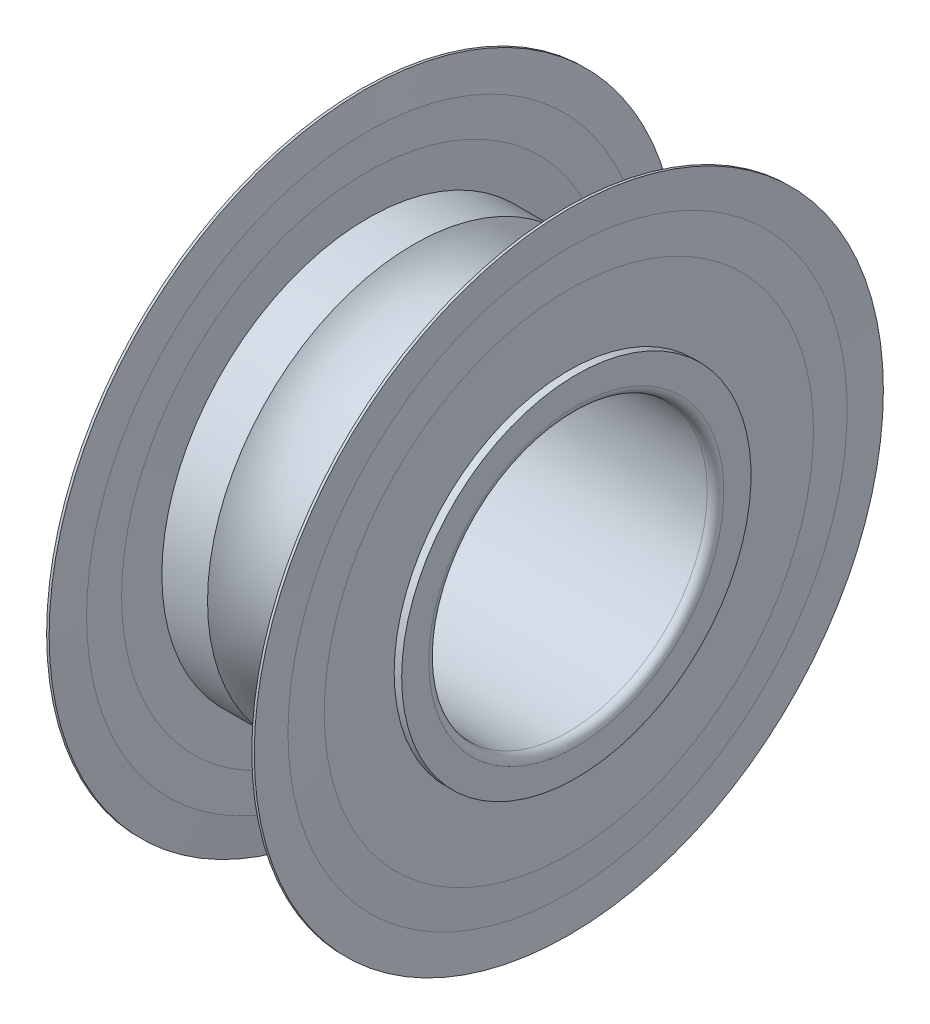
ISO-10303-21;
HEADER;
FILE_DESCRIPTION(('STEP AP214'),'2;1');
FILE_NAME('part.step','',(''),(''),'','','');
FILE_SCHEMA(('AUTOMOTIVE_DESIGN { 1 0 10303 214 1 1 1 1 }'));
ENDSEC;
DATA;
#1=APPLICATION_CONTEXT('core data for automotive mechanical design processes');
#2=APPLICATION_PROTOCOL_DEFINITION('international standard','automotive_design',2000,#1);
#3=PRODUCT_CONTEXT('',#1,'mechanical');
#4=PRODUCT('Part','Part','',(#3));
#5=PRODUCT_RELATED_PRODUCT_CATEGORY('part','',(#4));
#6=PRODUCT_DEFINITION_FORMATION('','',#4);
#7=PRODUCT_DEFINITION_CONTEXT('part definition',#1,'design');
#8=PRODUCT_DEFINITION('design','',#6,#7);
#9=PRODUCT_DEFINITION_SHAPE('','',#8);
#10=(LENGTH_UNIT() NAMED_UNIT(*) SI_UNIT(.MILLI.,.METRE.));
#11=(NAMED_UNIT(*) PLANE_ANGLE_UNIT() SI_UNIT($,.RADIAN.));
#12=(NAMED_UNIT(*) SI_UNIT($,.STERADIAN.) SOLID_ANGLE_UNIT());
#13=UNCERTAINTY_MEASURE_WITH_UNIT(LENGTH_MEASURE(1.E-05),#10,'distance_accuracy_value','');
#14=(GEOMETRIC_REPRESENTATION_CONTEXT(3) GLOBAL_UNCERTAINTY_ASSIGNED_CONTEXT((#13)) GLOBAL_UNIT_ASSIGNED_CONTEXT((#10,
#11,#12)) REPRESENTATION_CONTEXT('',''));
#15=CARTESIAN_POINT('',(0.,0.,0.));
#16=DIRECTION('',(0.,0.,1.));
#17=DIRECTION('',(1.,0.,0.));
#18=AXIS2_PLACEMENT_3D('',#15,#16,#17);
#19=CARTESIAN_POINT('',(7.71499999999991,0.,0.));
#20=DIRECTION('',(-1.,0.,0.));
#21=DIRECTION('',(0.,0.,1.));
#22=AXIS2_PLACEMENT_3D('',#19,#20,#21);
#23=TOROIDAL_SURFACE('',#22,6.49999999999991,0.224999999999907);
#24=CARTESIAN_POINT('',(7.49,0.,0.));
#25=DIRECTION('',(-1.,0.,0.));
#26=DIRECTION('',(0.,0.,1.));
#27=AXIS2_PLACEMENT_3D('',#24,#25,#26);
#28=CIRCLE('',#27,6.5);
#29=CARTESIAN_POINT('',(7.49,0.,6.5));
#30=VERTEX_POINT('',#29);
#31=EDGE_CURVE('E61',#30,#30,#28,.T.);
#32=ORIENTED_EDGE('',*,*,#31,.F.);
#33=EDGE_LOOP('',(#32));
#34=FACE_BOUND('',#33,.T.);
#35=CARTESIAN_POINT('',(7.63953312443505,0.,0.));
#36=DIRECTION('',(-1.,0.,0.));
#37=DIRECTION('',(0.,0.,1.));
#38=AXIS2_PLACEMENT_3D('',#35,#36,#37);
#39=CIRCLE('',#38,6.28803360952153);
#40=CARTESIAN_POINT('',(7.63953312443505,0.,6.28803360952153));
#41=VERTEX_POINT('',#40);
#42=EDGE_CURVE('E34',#41,#41,#39,.T.);
#43=ORIENTED_EDGE('',*,*,#42,.T.);
#44=EDGE_LOOP('',(#43));
#45=FACE_BOUND('',#44,.T.);
#46=ADVANCED_FACE('F30',(#34,#45),#23,.F.);
#47=CARTESIAN_POINT('',(50.,0.,0.));
#48=DIRECTION('',(-1.,0.,0.));
#49=DIRECTION('',(0.,0.,1.));
#50=AXIS2_PLACEMENT_3D('',#47,#48,#49);
#51=CYLINDRICAL_SURFACE('',#50,6.275);
#52=CARTESIAN_POINT('',(8.,0.,0.));
#53=DIRECTION('',(-1.,0.,0.));
#54=DIRECTION('',(0.,0.,1.));
#55=AXIS2_PLACEMENT_3D('',#52,#53,#54);
#56=CIRCLE('',#55,6.275);
#57=CARTESIAN_POINT('',(8.,0.,6.275));
#58=VERTEX_POINT('',#57);
#59=EDGE_CURVE('E56',#58,#58,#56,.T.);
#60=ORIENTED_EDGE('',*,*,#59,.T.);
#61=EDGE_LOOP('',(#60));
#62=FACE_BOUND('',#61,.T.);
#63=CARTESIAN_POINT('',(7.73,0.,0.));
#64=DIRECTION('',(-1.,0.,0.));
#65=DIRECTION('',(0.,0.,1.));
#66=AXIS2_PLACEMENT_3D('',#63,#64,#65);
#67=CIRCLE('',#66,6.275);
#68=CARTESIAN_POINT('',(7.73,0.,6.275));
#69=VERTEX_POINT('',#68);
#70=EDGE_CURVE('E158',#69,#69,#67,.T.);
#71=ORIENTED_EDGE('',*,*,#70,.F.);
#72=EDGE_LOOP('',(#71));
#73=FACE_BOUND('',#72,.T.);
#74=ADVANCED_FACE('F107',(#62,#73),#51,.T.);
#75=CARTESIAN_POINT('',(50.,0.,0.));
#76=DIRECTION('',(-1.,0.,0.));
#77=DIRECTION('',(0.,0.,1.));
#78=AXIS2_PLACEMENT_3D('',#75,#76,#77);
#79=CYLINDRICAL_SURFACE('',#78,6.275);
#80=CARTESIAN_POINT('',(0.,0.,0.));
#81=DIRECTION('',(-1.,0.,0.));
#82=DIRECTION('',(0.,0.,1.));
#83=AXIS2_PLACEMENT_3D('',#80,#81,#82);
#84=CIRCLE('',#83,6.275);
#85=CARTESIAN_POINT('',(0.,0.,6.275));
#86=VERTEX_POINT('',#85);
#87=EDGE_CURVE('E51',#86,#86,#84,.T.);
#88=ORIENTED_EDGE('',*,*,#87,.F.);
#89=EDGE_LOOP('',(#88));
#90=FACE_BOUND('',#89,.T.);
#91=CARTESIAN_POINT('',(0.269999999999999,0.,0.));
#92=DIRECTION('',(-1.,0.,0.));
#93=DIRECTION('',(0.,0.,1.));
#94=AXIS2_PLACEMENT_3D('',#91,#92,#93);
#95=CIRCLE('',#94,6.275);
#96=CARTESIAN_POINT('',(0.269999999999999,0.,6.275));
#97=VERTEX_POINT('',#96);
#98=EDGE_CURVE('E182',#97,#97,#95,.T.);
#99=ORIENTED_EDGE('',*,*,#98,.T.);
#100=EDGE_LOOP('',(#99));
#101=FACE_BOUND('',#100,.T.);
#102=ADVANCED_FACE('F113',(#90,#101),#79,.T.);
#103=CARTESIAN_POINT('',(0.285000000000041,0.,0.));
#104=DIRECTION('',(-1.,0.,0.));
#105=DIRECTION('',(0.,0.,1.));
#106=AXIS2_PLACEMENT_3D('',#103,#104,#105);
#107=TOROIDAL_SURFACE('',#106,6.49999999999996,0.224999999999959);
#108=CARTESIAN_POINT('',(0.509999999999997,0.,0.));
#109=DIRECTION('',(-1.,0.,0.));
#110=DIRECTION('',(0.,0.,1.));
#111=AXIS2_PLACEMENT_3D('',#108,#109,#110);
#112=CIRCLE('',#111,6.49999999999996);
#113=CARTESIAN_POINT('',(0.509999999999997,0.,6.49999999999996));
#114=VERTEX_POINT('',#113);
#115=EDGE_CURVE('E75',#114,#114,#112,.T.);
#116=ORIENTED_EDGE('',*,*,#115,.T.);
#117=EDGE_LOOP('',(#116));
#118=FACE_BOUND('',#117,.T.);
#119=CARTESIAN_POINT('',(0.360466875564949,0.,0.));
#120=DIRECTION('',(1.,0.,0.));
#121=DIRECTION('',(0.,0.,-1.));
#122=AXIS2_PLACEMENT_3D('',#119,#120,#121);
#123=CIRCLE('',#122,6.28803360952153);
#124=CARTESIAN_POINT('',(0.360466875564949,0.,-6.28803360952153));
#125=VERTEX_POINT('',#124);
#126=EDGE_CURVE('E54',#125,#125,#123,.T.);
#127=ORIENTED_EDGE('',*,*,#126,.T.);
#128=EDGE_LOOP('',(#127));
#129=FACE_BOUND('',#128,.T.);
#130=ADVANCED_FACE('F129',(#118,#129),#107,.F.);
#131=CARTESIAN_POINT('',(0.,7.3,0.));
#132=DIRECTION('',(1.,0.,0.));
#133=DIRECTION('',(0.,0.,-1.));
#134=AXIS2_PLACEMENT_3D('',#131,#132,#133);
#135=PLANE('',#134);
#136=CARTESIAN_POINT('',(0.,0.,0.));
#137=DIRECTION('',(-1.,0.,0.));
#138=DIRECTION('',(0.,0.,1.));
#139=AXIS2_PLACEMENT_3D('',#136,#137,#138);
#140=CIRCLE('',#139,5.3);
#141=CARTESIAN_POINT('',(0.,0.,5.3));
#142=VERTEX_POINT('',#141);
#143=EDGE_CURVE('E10',#142,#142,#140,.T.);
#144=ORIENTED_EDGE('',*,*,#143,.F.);
#145=EDGE_LOOP('',(#144));
#146=FACE_BOUND('',#145,.T.);
#147=ORIENTED_EDGE('',*,*,#87,.T.);
#148=EDGE_LOOP('',(#147));
#149=FACE_BOUND('',#148,.T.);
#150=ADVANCED_FACE('F32',(#146,#149),#135,.F.);
#151=CARTESIAN_POINT('',(8.,5.3,0.));
#152=DIRECTION('',(-1.,0.,0.));
#153=DIRECTION('',(0.,0.,1.));
#154=AXIS2_PLACEMENT_3D('',#151,#152,#153);
#155=PLANE('',#154);
#156=CARTESIAN_POINT('',(8.,0.,0.));
#157=DIRECTION('',(-1.,0.,0.));
#158=DIRECTION('',(0.,0.,1.));
#159=AXIS2_PLACEMENT_3D('',#156,#157,#158);
#160=CIRCLE('',#159,5.29999999999988);
#161=CARTESIAN_POINT('',(8.,0.,5.29999999999988));
#162=VERTEX_POINT('',#161);
#163=EDGE_CURVE('E85',#162,#162,#160,.T.);
#164=ORIENTED_EDGE('',*,*,#163,.T.);
#165=EDGE_LOOP('',(#164));
#166=FACE_BOUND('',#165,.T.);
#167=ORIENTED_EDGE('',*,*,#59,.F.);
#168=EDGE_LOOP('',(#167));
#169=FACE_BOUND('',#168,.T.);
#170=ADVANCED_FACE('F100',(#166,#169),#155,.F.);
#171=CARTESIAN_POINT('',(0.29999999999994,0.,0.));
#172=DIRECTION('',(-1.,0.,0.));
#173=DIRECTION('',(0.,0.,1.));
#174=AXIS2_PLACEMENT_3D('',#171,#172,#173);
#175=TOROIDAL_SURFACE('',#174,5.29999999999994,0.29999999999994);
#176=CARTESIAN_POINT('',(0.300000000000002,0.,0.));
#177=DIRECTION('',(-1.,0.,0.));
#178=DIRECTION('',(0.,0.,1.));
#179=AXIS2_PLACEMENT_3D('',#176,#177,#178);
#180=CIRCLE('',#179,5.);
#181=CARTESIAN_POINT('',(0.300000000000002,0.,5.));
#182=VERTEX_POINT('',#181);
#183=EDGE_CURVE('E38',#182,#182,#180,.T.);
#184=ORIENTED_EDGE('',*,*,#183,.F.);
#185=EDGE_LOOP('',(#184));
#186=FACE_BOUND('',#185,.T.);
#187=ORIENTED_EDGE('',*,*,#143,.T.);
#188=EDGE_LOOP('',(#187));
#189=FACE_BOUND('',#188,.T.);
#190=ADVANCED_FACE('F95',(#186,#189),#175,.T.);
#191=CARTESIAN_POINT('',(50.,0.,0.));
#192=DIRECTION('',(-1.,0.,0.));
#193=DIRECTION('',(0.,0.,1.));
#194=AXIS2_PLACEMENT_3D('',#191,#192,#193);
#195=CYLINDRICAL_SURFACE('',#194,5.);
#196=CARTESIAN_POINT('',(7.7,0.,0.));
#197=DIRECTION('',(-1.,0.,0.));
#198=DIRECTION('',(0.,0.,1.));
#199=AXIS2_PLACEMENT_3D('',#196,#197,#198);
#200=CIRCLE('',#199,5.);
#201=CARTESIAN_POINT('',(7.7,0.,5.));
#202=VERTEX_POINT('',#201);
#203=EDGE_CURVE('E43',#202,#202,#200,.T.);
#204=ORIENTED_EDGE('',*,*,#203,.F.);
#205=EDGE_LOOP('',(#204));
#206=FACE_BOUND('',#205,.T.);
#207=ORIENTED_EDGE('',*,*,#183,.T.);
#208=EDGE_LOOP('',(#207));
#209=FACE_BOUND('',#208,.T.);
#210=ADVANCED_FACE('F92',(#206,#209),#195,.F.);
#211=CARTESIAN_POINT('',(7.70000000000012,0.,0.));
#212=DIRECTION('',(-1.,0.,0.));
#213=DIRECTION('',(0.,0.,1.));
#214=AXIS2_PLACEMENT_3D('',#211,#212,#213);
#215=TOROIDAL_SURFACE('',#214,5.29999999999988,0.299999999999879);
#216=ORIENTED_EDGE('',*,*,#163,.F.);
#217=EDGE_LOOP('',(#216));
#218=FACE_BOUND('',#217,.T.);
#219=ORIENTED_EDGE('',*,*,#203,.T.);
#220=EDGE_LOOP('',(#219));
#221=FACE_BOUND('',#220,.T.);
#222=ADVANCED_FACE('F90',(#218,#221),#215,.T.);
#223=CARTESIAN_POINT('',(0.51,6.5,0.));
#224=DIRECTION('',(-1.,0.,0.));
#225=DIRECTION('',(0.,0.,1.));
#226=AXIS2_PLACEMENT_3D('',#223,#224,#225);
#227=PLANE('',#226);
#228=ORIENTED_EDGE('',*,*,#115,.F.);
#229=EDGE_LOOP('',(#228));
#230=FACE_BOUND('',#229,.T.);
#231=CARTESIAN_POINT('',(0.509999999999997,0.,0.));
#232=DIRECTION('',(-1.,0.,0.));
#233=DIRECTION('',(0.,0.,1.));
#234=AXIS2_PLACEMENT_3D('',#231,#232,#233);
#235=CIRCLE('',#234,7.4);
#236=CARTESIAN_POINT('',(0.509999999999997,0.,7.4));
#237=VERTEX_POINT('',#236);
#238=EDGE_CURVE('E47',#237,#237,#235,.T.);
#239=ORIENTED_EDGE('',*,*,#238,.T.);
#240=EDGE_LOOP('',(#239));
#241=FACE_BOUND('',#240,.T.);
#242=ADVANCED_FACE('F124',(#230,#241),#227,.T.);
#243=CARTESIAN_POINT('',(7.49,9.525,0.));
#244=DIRECTION('',(1.,0.,0.));
#245=DIRECTION('',(0.,0.,-1.));
#246=AXIS2_PLACEMENT_3D('',#243,#244,#245);
#247=PLANE('',#246);
#248=ORIENTED_EDGE('',*,*,#31,.T.);
#249=EDGE_LOOP('',(#248));
#250=FACE_BOUND('',#249,.T.);
#251=CARTESIAN_POINT('',(7.49,0.,0.));
#252=DIRECTION('',(1.,0.,0.));
#253=DIRECTION('',(0.,0.,-1.));
#254=AXIS2_PLACEMENT_3D('',#251,#252,#253);
#255=CIRCLE('',#254,7.4);
#256=CARTESIAN_POINT('',(7.49,0.,-7.4));
#257=VERTEX_POINT('',#256);
#258=EDGE_CURVE('E50',#257,#257,#255,.T.);
#259=ORIENTED_EDGE('',*,*,#258,.T.);
#260=EDGE_LOOP('',(#259));
#261=FACE_BOUND('',#260,.T.);
#262=ADVANCED_FACE('F120',(#250,#261),#247,.T.);
#263=CARTESIAN_POINT('',(50.,0.,0.));
#264=DIRECTION('',(-1.,0.,0.));
#265=DIRECTION('',(0.,0.,1.));
#266=AXIS2_PLACEMENT_3D('',#263,#264,#265);
#267=CYLINDRICAL_SURFACE('',#266,7.4);
#268=CARTESIAN_POINT('',(5.8490973473563,0.,0.));
#269=DIRECTION('',(-1.,0.,0.));
#270=DIRECTION('',(0.,0.,1.));
#271=AXIS2_PLACEMENT_3D('',#268,#269,#270);
#272=CIRCLE('',#271,7.4);
#273=CARTESIAN_POINT('',(5.8490973473563,0.,7.4));
#274=VERTEX_POINT('',#273);
#275=EDGE_CURVE('E82',#274,#274,#272,.T.);
#276=ORIENTED_EDGE('',*,*,#275,.F.);
#277=EDGE_LOOP('',(#276));
#278=FACE_BOUND('',#277,.T.);
#279=ORIENTED_EDGE('',*,*,#258,.F.);
#280=EDGE_LOOP('',(#279));
#281=FACE_BOUND('',#280,.T.);
#282=ADVANCED_FACE('F123',(#278,#281),#267,.T.);
#283=CARTESIAN_POINT('',(4.,0.,0.));
#284=DIRECTION('',(-1.,0.,0.));
#285=DIRECTION('',(0.,0.,1.));
#286=AXIS2_PLACEMENT_3D('',#283,#284,#285);
#287=TOROIDAL_SURFACE('',#286,8.90000000000006,2.38100000000006);
#288=CARTESIAN_POINT('',(2.1509026526437,0.,0.));
#289=DIRECTION('',(-1.,0.,0.));
#290=DIRECTION('',(0.,0.,1.));
#291=AXIS2_PLACEMENT_3D('',#288,#289,#290);
#292=CIRCLE('',#291,7.4);
#293=CARTESIAN_POINT('',(2.1509026526437,0.,7.4));
#294=VERTEX_POINT('',#293);
#295=EDGE_CURVE('E53',#294,#294,#292,.T.);
#296=ORIENTED_EDGE('',*,*,#295,.F.);
#297=EDGE_LOOP('',(#296));
#298=FACE_BOUND('',#297,.T.);
#299=ORIENTED_EDGE('',*,*,#275,.T.);
#300=EDGE_LOOP('',(#299));
#301=FACE_BOUND('',#300,.T.);
#302=ADVANCED_FACE('F140',(#298,#301),#287,.F.);
#303=CARTESIAN_POINT('',(50.,0.,0.));
#304=DIRECTION('',(-1.,0.,0.));
#305=DIRECTION('',(0.,0.,1.));
#306=AXIS2_PLACEMENT_3D('',#303,#304,#305);
#307=CYLINDRICAL_SURFACE('',#306,7.4);
#308=ORIENTED_EDGE('',*,*,#295,.T.);
#309=EDGE_LOOP('',(#308));
#310=FACE_BOUND('',#309,.T.);
#311=ORIENTED_EDGE('',*,*,#238,.F.);
#312=EDGE_LOOP('',(#311));
#313=FACE_BOUND('',#312,.T.);
#314=ADVANCED_FACE('F136',(#310,#313),#307,.T.);
#315=CARTESIAN_POINT('',(50.,0.,0.));
#316=DIRECTION('',(-1.,0.,0.));
#317=DIRECTION('',(0.,0.,1.));
#318=AXIS2_PLACEMENT_3D('',#315,#316,#317);
#319=CYLINDRICAL_SURFACE('',#318,11.3);
#320=CARTESIAN_POINT('',(0.269999999999999,0.,0.));
#321=DIRECTION('',(-1.,0.,0.));
#322=DIRECTION('',(0.,0.,1.));
#323=AXIS2_PLACEMENT_3D('',#320,#321,#322);
#324=CIRCLE('',#323,11.3);
#325=CARTESIAN_POINT('',(0.269999999999999,0.,11.3));
#326=VERTEX_POINT('',#325);
#327=EDGE_CURVE('E57',#326,#326,#324,.T.);
#328=ORIENTED_EDGE('',*,*,#327,.F.);
#329=EDGE_LOOP('',(#328));
#330=FACE_BOUND('',#329,.T.);
#331=CARTESIAN_POINT('',(0.359999999999999,0.,0.));
#332=DIRECTION('',(-1.,0.,0.));
#333=DIRECTION('',(0.,0.,1.));
#334=AXIS2_PLACEMENT_3D('',#331,#332,#333);
#335=CIRCLE('',#334,11.3);
#336=CARTESIAN_POINT('',(0.359999999999999,0.,11.3));
#337=VERTEX_POINT('',#336);
#338=EDGE_CURVE('E173',#337,#337,#335,.T.);
#339=ORIENTED_EDGE('',*,*,#338,.T.);
#340=EDGE_LOOP('',(#339));
#341=FACE_BOUND('',#340,.T.);
#342=ADVANCED_FACE('F139',(#330,#341),#319,.T.);
#343=CARTESIAN_POINT('',(0.269999999999999,0.,0.));
#344=DIRECTION('',(-1.,0.,0.));
#345=DIRECTION('',(0.,0.,1.));
#346=AXIS2_PLACEMENT_3D('',#343,#344,#345);
#347=CONICAL_SURFACE('',#346,11.3,1.53499074052142);
#348=CARTESIAN_POINT('',(0.315000000000003,0.,0.));
#349=DIRECTION('',(-1.,0.,0.));
#350=DIRECTION('',(0.,0.,1.));
#351=AXIS2_PLACEMENT_3D('',#348,#349,#350);
#352=CIRCLE('',#351,10.04375);
#353=CARTESIAN_POINT('',(0.315000000000003,0.,10.04375));
#354=VERTEX_POINT('',#353);
#355=EDGE_CURVE('E64',#354,#354,#352,.T.);
#356=ORIENTED_EDGE('',*,*,#355,.F.);
#357=EDGE_LOOP('',(#356));
#358=FACE_BOUND('',#357,.T.);
#359=ORIENTED_EDGE('',*,*,#327,.T.);
#360=EDGE_LOOP('',(#359));
#361=FACE_BOUND('',#360,.T.);
#362=ADVANCED_FACE('F192',(#358,#361),#347,.F.);
#363=CARTESIAN_POINT('',(0.315000000000003,0.,0.));
#364=DIRECTION('',(1.,0.,0.));
#365=DIRECTION('',(0.,0.,-1.));
#366=AXIS2_PLACEMENT_3D('',#363,#364,#365);
#367=CONICAL_SURFACE('',#366,10.04375,1.53499074052142);
#368=CARTESIAN_POINT('',(0.269999999999999,0.,0.));
#369=DIRECTION('',(-1.,0.,0.));
#370=DIRECTION('',(0.,0.,1.));
#371=AXIS2_PLACEMENT_3D('',#368,#369,#370);
#372=CIRCLE('',#371,8.7875);
#373=CARTESIAN_POINT('',(0.269999999999999,0.,8.7875));
#374=VERTEX_POINT('',#373);
#375=EDGE_CURVE('E69',#374,#374,#372,.T.);
#376=ORIENTED_EDGE('',*,*,#375,.F.);
#377=EDGE_LOOP('',(#376));
#378=FACE_BOUND('',#377,.T.);
#379=ORIENTED_EDGE('',*,*,#355,.T.);
#380=EDGE_LOOP('',(#379));
#381=FACE_BOUND('',#380,.T.);
#382=ADVANCED_FACE('F189',(#378,#381),#367,.T.);
#383=CARTESIAN_POINT('',(0.27,8.7875,0.));
#384=DIRECTION('',(1.,0.,0.));
#385=DIRECTION('',(0.,0.,-1.));
#386=AXIS2_PLACEMENT_3D('',#383,#384,#385);
#387=PLANE('',#386);
#388=ORIENTED_EDGE('',*,*,#98,.F.);
#389=EDGE_LOOP('',(#388));
#390=FACE_BOUND('',#389,.T.);
#391=ORIENTED_EDGE('',*,*,#375,.T.);
#392=EDGE_LOOP('',(#391));
#393=FACE_BOUND('',#392,.T.);
#394=ADVANCED_FACE('F187',(#390,#393),#387,.F.);
#395=CARTESIAN_POINT('',(0.359999999999999,0.,0.));
#396=DIRECTION('',(1.,0.,0.));
#397=DIRECTION('',(0.,0.,-1.));
#398=AXIS2_PLACEMENT_3D('',#395,#396,#397);
#399=CONICAL_SURFACE('',#398,6.275,1.53499074052143);
#400=ORIENTED_EDGE('',*,*,#126,.F.);
#401=EDGE_LOOP('',(#400));
#402=FACE_BOUND('',#401,.T.);
#403=CARTESIAN_POINT('',(0.449999999999999,0.,0.));
#404=DIRECTION('',(-1.,0.,0.));
#405=DIRECTION('',(0.,0.,1.));
#406=AXIS2_PLACEMENT_3D('',#403,#404,#405);
#407=CIRCLE('',#406,8.7875);
#408=CARTESIAN_POINT('',(0.449999999999999,0.,8.7875));
#409=VERTEX_POINT('',#408);
#410=EDGE_CURVE('E179',#409,#409,#407,.T.);
#411=ORIENTED_EDGE('',*,*,#410,.F.);
#412=EDGE_LOOP('',(#411));
#413=FACE_BOUND('',#412,.T.);
#414=ADVANCED_FACE('F205',(#402,#413),#399,.F.);
#415=CARTESIAN_POINT('',(0.45,8.7875,0.));
#416=DIRECTION('',(-1.,0.,0.));
#417=DIRECTION('',(0.,0.,1.));
#418=AXIS2_PLACEMENT_3D('',#415,#416,#417);
#419=PLANE('',#418);
#420=CARTESIAN_POINT('',(0.449999999999999,0.,0.));
#421=DIRECTION('',(-1.,0.,0.));
#422=DIRECTION('',(0.,0.,1.));
#423=AXIS2_PLACEMENT_3D('',#420,#421,#422);
#424=CIRCLE('',#423,10.04375);
#425=CARTESIAN_POINT('',(0.449999999999999,0.,10.04375));
#426=VERTEX_POINT('',#425);
#427=EDGE_CURVE('E176',#426,#426,#424,.T.);
#428=ORIENTED_EDGE('',*,*,#427,.F.);
#429=EDGE_LOOP('',(#428));
#430=FACE_BOUND('',#429,.T.);
#431=ORIENTED_EDGE('',*,*,#410,.T.);
#432=EDGE_LOOP('',(#431));
#433=FACE_BOUND('',#432,.T.);
#434=ADVANCED_FACE('F209',(#430,#433),#419,.F.);
#435=CARTESIAN_POINT('',(0.449999999999999,0.,0.));
#436=DIRECTION('',(-1.,0.,0.));
#437=DIRECTION('',(0.,0.,1.));
#438=AXIS2_PLACEMENT_3D('',#435,#436,#437);
#439=CONICAL_SURFACE('',#438,10.04375,1.49927672794406);
#440=ORIENTED_EDGE('',*,*,#338,.F.);
#441=EDGE_LOOP('',(#440));
#442=FACE_BOUND('',#441,.T.);
#443=ORIENTED_EDGE('',*,*,#427,.T.);
#444=EDGE_LOOP('',(#443));
#445=FACE_BOUND('',#444,.T.);
#446=ADVANCED_FACE('F213',(#442,#445),#439,.T.);
#447=CARTESIAN_POINT('',(7.64,0.,0.));
#448=DIRECTION('',(1.,0.,0.));
#449=DIRECTION('',(0.,0.,-1.));
#450=AXIS2_PLACEMENT_3D('',#447,#448,#449);
#451=CONICAL_SURFACE('',#450,11.3,1.49927672794406);
#452=CARTESIAN_POINT('',(7.55,0.,0.));
#453=DIRECTION('',(-1.,0.,0.));
#454=DIRECTION('',(0.,0.,1.));
#455=AXIS2_PLACEMENT_3D('',#452,#453,#454);
#456=CIRCLE('',#455,10.04375);
#457=CARTESIAN_POINT('',(7.55,0.,10.04375));
#458=VERTEX_POINT('',#457);
#459=EDGE_CURVE('E164',#458,#458,#456,.T.);
#460=ORIENTED_EDGE('',*,*,#459,.F.);
#461=EDGE_LOOP('',(#460));
#462=FACE_BOUND('',#461,.T.);
#463=CARTESIAN_POINT('',(7.64,0.,0.));
#464=DIRECTION('',(-1.,0.,0.));
#465=DIRECTION('',(0.,0.,1.));
#466=AXIS2_PLACEMENT_3D('',#463,#464,#465);
#467=CIRCLE('',#466,11.3);
#468=CARTESIAN_POINT('',(7.64,0.,11.3));
#469=VERTEX_POINT('',#468);
#470=EDGE_CURVE('E250',#469,#469,#467,.T.);
#471=ORIENTED_EDGE('',*,*,#470,.T.);
#472=EDGE_LOOP('',(#471));
#473=FACE_BOUND('',#472,.T.);
#474=ADVANCED_FACE('F217',(#462,#473),#451,.T.);
#475=CARTESIAN_POINT('',(7.55,10.04375,0.));
#476=DIRECTION('',(1.,0.,0.));
#477=DIRECTION('',(0.,0.,-1.));
#478=AXIS2_PLACEMENT_3D('',#475,#476,#477);
#479=PLANE('',#478);
#480=CARTESIAN_POINT('',(7.55,0.,0.));
#481=DIRECTION('',(-1.,0.,0.));
#482=DIRECTION('',(0.,0.,1.));
#483=AXIS2_PLACEMENT_3D('',#480,#481,#482);
#484=CIRCLE('',#483,8.7875);
#485=CARTESIAN_POINT('',(7.55,0.,8.7875));
#486=VERTEX_POINT('',#485);
#487=EDGE_CURVE('E160',#486,#486,#484,.T.);
#488=ORIENTED_EDGE('',*,*,#487,.F.);
#489=EDGE_LOOP('',(#488));
#490=FACE_BOUND('',#489,.T.);
#491=ORIENTED_EDGE('',*,*,#459,.T.);
#492=EDGE_LOOP('',(#491));
#493=FACE_BOUND('',#492,.T.);
#494=ADVANCED_FACE('F221',(#490,#493),#479,.F.);
#495=CARTESIAN_POINT('',(7.55,0.,0.));
#496=DIRECTION('',(-1.,0.,0.));
#497=DIRECTION('',(0.,0.,1.));
#498=AXIS2_PLACEMENT_3D('',#495,#496,#497);
#499=CONICAL_SURFACE('',#498,8.7875,1.53499074052143);
#500=ORIENTED_EDGE('',*,*,#42,.F.);
#501=EDGE_LOOP('',(#500));
#502=FACE_BOUND('',#501,.T.);
#503=ORIENTED_EDGE('',*,*,#487,.T.);
#504=EDGE_LOOP('',(#503));
#505=FACE_BOUND('',#504,.T.);
#506=ADVANCED_FACE('F225',(#502,#505),#499,.F.);
#507=CARTESIAN_POINT('',(7.73,6.275,0.));
#508=DIRECTION('',(-1.,0.,0.));
#509=DIRECTION('',(0.,0.,1.));
#510=AXIS2_PLACEMENT_3D('',#507,#508,#509);
#511=PLANE('',#510);
#512=CARTESIAN_POINT('',(7.73,0.,0.));
#513=DIRECTION('',(-1.,0.,0.));
#514=DIRECTION('',(0.,0.,1.));
#515=AXIS2_PLACEMENT_3D('',#512,#513,#514);
#516=CIRCLE('',#515,8.7875);
#517=CARTESIAN_POINT('',(7.73,0.,8.7875));
#518=VERTEX_POINT('',#517);
#519=EDGE_CURVE('E161',#518,#518,#516,.T.);
#520=ORIENTED_EDGE('',*,*,#519,.F.);
#521=EDGE_LOOP('',(#520));
#522=FACE_BOUND('',#521,.T.);
#523=ORIENTED_EDGE('',*,*,#70,.T.);
#524=EDGE_LOOP('',(#523));
#525=FACE_BOUND('',#524,.T.);
#526=ADVANCED_FACE('F229',(#522,#525),#511,.F.);
#527=CARTESIAN_POINT('',(7.73,0.,0.));
#528=DIRECTION('',(-1.,0.,0.));
#529=DIRECTION('',(0.,0.,1.));
#530=AXIS2_PLACEMENT_3D('',#527,#528,#529);
#531=CONICAL_SURFACE('',#530,8.7875,1.53499074052142);
#532=CARTESIAN_POINT('',(7.685,0.,0.));
#533=DIRECTION('',(-1.,0.,0.));
#534=DIRECTION('',(0.,0.,1.));
#535=AXIS2_PLACEMENT_3D('',#532,#533,#534);
#536=CIRCLE('',#535,10.04375);
#537=CARTESIAN_POINT('',(7.685,0.,10.04375));
#538=VERTEX_POINT('',#537);
#539=EDGE_CURVE('E167',#538,#538,#536,.T.);
#540=ORIENTED_EDGE('',*,*,#539,.F.);
#541=EDGE_LOOP('',(#540));
#542=FACE_BOUND('',#541,.T.);
#543=ORIENTED_EDGE('',*,*,#519,.T.);
#544=EDGE_LOOP('',(#543));
#545=FACE_BOUND('',#544,.T.);
#546=ADVANCED_FACE('F233',(#542,#545),#531,.T.);
#547=CARTESIAN_POINT('',(7.685,0.,0.));
#548=DIRECTION('',(1.,0.,0.));
#549=DIRECTION('',(0.,0.,-1.));
#550=AXIS2_PLACEMENT_3D('',#547,#548,#549);
#551=CONICAL_SURFACE('',#550,10.04375,1.53499074052142);
#552=CARTESIAN_POINT('',(7.73,0.,0.));
#553=DIRECTION('',(-1.,0.,0.));
#554=DIRECTION('',(0.,0.,1.));
#555=AXIS2_PLACEMENT_3D('',#552,#553,#554);
#556=CIRCLE('',#555,11.3);
#557=CARTESIAN_POINT('',(7.73,0.,11.3));
#558=VERTEX_POINT('',#557);
#559=EDGE_CURVE('E253',#558,#558,#556,.T.);
#560=ORIENTED_EDGE('',*,*,#559,.F.);
#561=EDGE_LOOP('',(#560));
#562=FACE_BOUND('',#561,.T.);
#563=ORIENTED_EDGE('',*,*,#539,.T.);
#564=EDGE_LOOP('',(#563));
#565=FACE_BOUND('',#564,.T.);
#566=ADVANCED_FACE('F237',(#562,#565),#551,.F.);
#567=CARTESIAN_POINT('',(50.,0.,0.));
#568=DIRECTION('',(-1.,0.,0.));
#569=DIRECTION('',(0.,0.,1.));
#570=AXIS2_PLACEMENT_3D('',#567,#568,#569);
#571=CYLINDRICAL_SURFACE('',#570,11.3);
#572=ORIENTED_EDGE('',*,*,#470,.F.);
#573=EDGE_LOOP('',(#572));
#574=FACE_BOUND('',#573,.T.);
#575=ORIENTED_EDGE('',*,*,#559,.T.);
#576=EDGE_LOOP('',(#575));
#577=FACE_BOUND('',#576,.T.);
#578=ADVANCED_FACE('F241',(#574,#577),#571,.T.);
#579=CLOSED_SHELL('',(#46,#74,#102,#130,#150,#170,#190,#210,#222,#242,#262,#282,#302,#314,#342,
#362,#382,#394,#414,#434,#446,#474,#494,#506,#526,#546,#566,#578));
#580=MANIFOLD_SOLID_BREP('B2',#579);
#581=ADVANCED_BREP_SHAPE_REPRESENTATION('',(#18,#580),#14);
#582=SHAPE_DEFINITION_REPRESENTATION(#9,#581);
ENDSEC;
END-ISO-10303-21;
